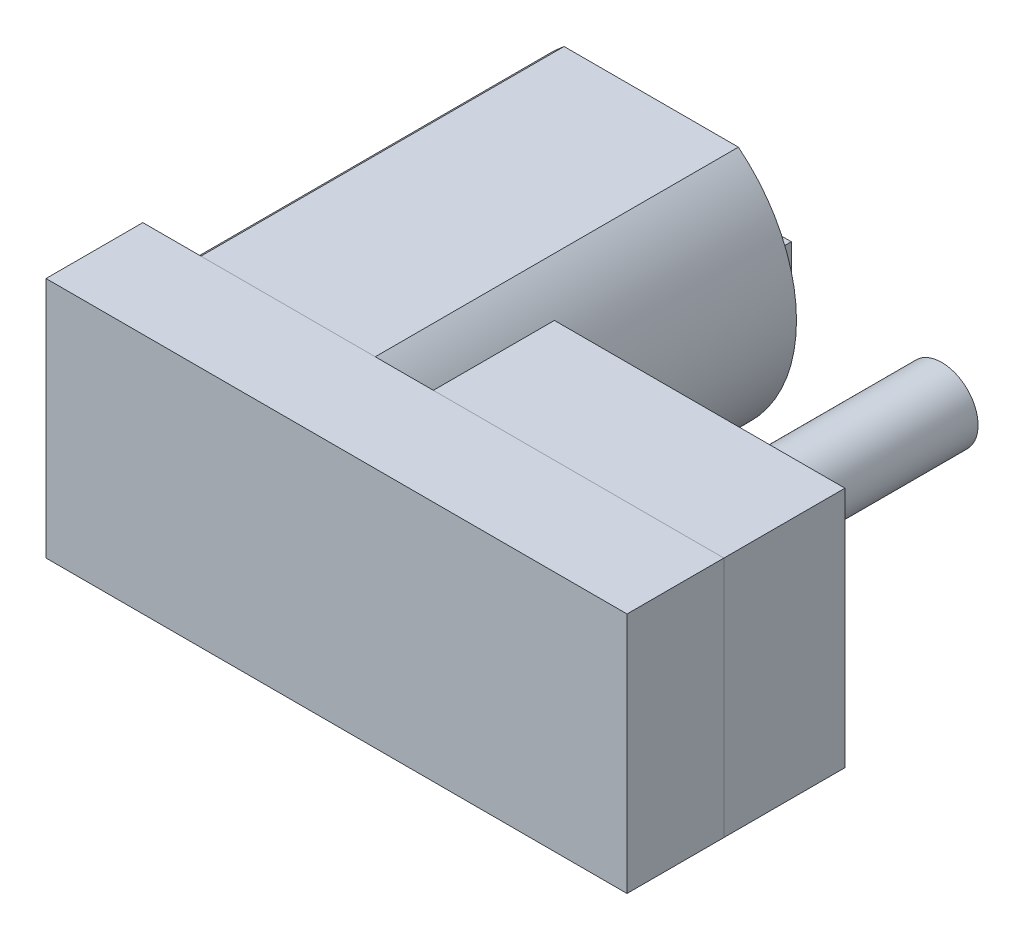
ISO-10303-21;
HEADER;
FILE_DESCRIPTION(('STEP AP214'),'2;1');
FILE_NAME('part.step','',(''),(''),'','','');
FILE_SCHEMA(('AUTOMOTIVE_DESIGN { 1 0 10303 214 1 1 1 1 }'));
ENDSEC;
DATA;
#1=APPLICATION_CONTEXT('core data for automotive mechanical design processes');
#2=APPLICATION_PROTOCOL_DEFINITION('international standard','automotive_design',2000,#1);
#3=PRODUCT_CONTEXT('',#1,'mechanical');
#4=PRODUCT('Part','Part','',(#3));
#5=PRODUCT_RELATED_PRODUCT_CATEGORY('part','',(#4));
#6=PRODUCT_DEFINITION_FORMATION('','',#4);
#7=PRODUCT_DEFINITION_CONTEXT('part definition',#1,'design');
#8=PRODUCT_DEFINITION('design','',#6,#7);
#9=PRODUCT_DEFINITION_SHAPE('','',#8);
#10=(LENGTH_UNIT() NAMED_UNIT(*) SI_UNIT(.MILLI.,.METRE.));
#11=(NAMED_UNIT(*) PLANE_ANGLE_UNIT() SI_UNIT($,.RADIAN.));
#12=(NAMED_UNIT(*) SI_UNIT($,.STERADIAN.) SOLID_ANGLE_UNIT());
#13=UNCERTAINTY_MEASURE_WITH_UNIT(LENGTH_MEASURE(1.E-05),#10,'distance_accuracy_value','');
#14=(GEOMETRIC_REPRESENTATION_CONTEXT(3) GLOBAL_UNCERTAINTY_ASSIGNED_CONTEXT((#13)) GLOBAL_UNIT_ASSIGNED_CONTEXT((#10,
#11,#12)) REPRESENTATION_CONTEXT('',''));
#15=CARTESIAN_POINT('',(0.,0.,0.));
#16=DIRECTION('',(0.,0.,1.));
#17=DIRECTION('',(1.,0.,0.));
#18=AXIS2_PLACEMENT_3D('',#15,#16,#17);
#19=CARTESIAN_POINT('',(18.,5.,-19.));
#20=DIRECTION('',(0.,0.,1.));
#21=DIRECTION('',(1.,0.,0.));
#22=AXIS2_PLACEMENT_3D('',#19,#20,#21);
#23=CYLINDRICAL_SURFACE('',#22,1.5);
#24=CARTESIAN_POINT('',(18.,5.,-19.));
#25=DIRECTION('',(0.,0.,-1.));
#26=DIRECTION('',(-1.,0.,0.));
#27=AXIS2_PLACEMENT_3D('',#24,#25,#26);
#28=CIRCLE('',#27,1.5);
#29=CARTESIAN_POINT('',(16.5,5.,-19.));
#30=VERTEX_POINT('',#29);
#31=EDGE_CURVE('E11',#30,#30,#28,.T.);
#32=ORIENTED_EDGE('',*,*,#31,.F.);
#33=EDGE_LOOP('',(#32));
#34=FACE_BOUND('',#33,.T.);
#35=CARTESIAN_POINT('',(18.,5.,-9.));
#36=DIRECTION('',(0.,0.,-1.));
#37=DIRECTION('',(-1.,0.,0.));
#38=AXIS2_PLACEMENT_3D('',#35,#36,#37);
#39=CIRCLE('',#38,1.5);
#40=CARTESIAN_POINT('',(16.5,5.,-9.));
#41=VERTEX_POINT('',#40);
#42=EDGE_CURVE('E54',#41,#41,#39,.T.);
#43=ORIENTED_EDGE('',*,*,#42,.T.);
#44=EDGE_LOOP('',(#43));
#45=FACE_BOUND('',#44,.T.);
#46=ADVANCED_FACE('F51',(#34,#45),#23,.T.);
#47=CARTESIAN_POINT('',(0.,0.,-19.));
#48=DIRECTION('',(0.,0.,-1.));
#49=DIRECTION('',(-1.,0.,0.));
#50=AXIS2_PLACEMENT_3D('',#47,#48,#49);
#51=PLANE('',#50);
#52=ORIENTED_EDGE('',*,*,#31,.T.);
#53=EDGE_LOOP('',(#52));
#54=FACE_BOUND('',#53,.T.);
#55=ADVANCED_FACE('F66',(#54),#51,.T.);
#56=CARTESIAN_POINT('',(0.,0.,-9.));
#57=DIRECTION('',(0.,0.,-1.));
#58=DIRECTION('',(-1.,0.,0.));
#59=AXIS2_PLACEMENT_3D('',#56,#57,#58);
#60=PLANE('',#59);
#61=ORIENTED_EDGE('',*,*,#42,.F.);
#62=EDGE_LOOP('',(#61));
#63=FACE_BOUND('',#62,.T.);
#64=ADVANCED_FACE('F64',(#63),#60,.F.);
#65=CLOSED_SHELL('',(#46,#55,#64));
#66=MANIFOLD_SOLID_BREP('B2',#65);
#67=CARTESIAN_POINT('',(24.,10.,-9.));
#68=DIRECTION('',(-1.,0.,0.));
#69=DIRECTION('',(0.,0.,1.));
#70=AXIS2_PLACEMENT_3D('',#67,#68,#69);
#71=PLANE('',#70);
#72=DIRECTION('',(0.,-1.,0.));
#73=VECTOR('',#72,1.);
#74=CARTESIAN_POINT('',(24.,10.,-4.));
#75=LINE('',#74,#73);
#76=CARTESIAN_POINT('',(24.,10.,-4.));
#77=VERTEX_POINT('',#76);
#78=CARTESIAN_POINT('',(24.,0.,-4.));
#79=VERTEX_POINT('',#78);
#80=EDGE_CURVE('E164',#77,#79,#75,.T.);
#81=ORIENTED_EDGE('',*,*,#80,.T.);
#82=DIRECTION('',(0.,0.,1.));
#83=VECTOR('',#82,1.);
#84=CARTESIAN_POINT('',(24.,0.,-9.));
#85=LINE('',#84,#83);
#86=CARTESIAN_POINT('',(24.,0.,-9.));
#87=VERTEX_POINT('',#86);
#88=EDGE_CURVE('E49',#87,#79,#85,.T.);
#89=ORIENTED_EDGE('',*,*,#88,.F.);
#90=DIRECTION('',(0.,-1.,0.));
#91=VECTOR('',#90,1.);
#92=CARTESIAN_POINT('',(24.,10.,-9.));
#93=LINE('',#92,#91);
#94=CARTESIAN_POINT('',(24.,10.,-9.));
#95=VERTEX_POINT('',#94);
#96=EDGE_CURVE('E152',#95,#87,#93,.T.);
#97=ORIENTED_EDGE('',*,*,#96,.F.);
#98=DIRECTION('',(0.,0.,1.));
#99=VECTOR('',#98,1.);
#100=CARTESIAN_POINT('',(24.,10.,-9.));
#101=LINE('',#100,#99);
#102=EDGE_CURVE('E160',#95,#77,#101,.T.);
#103=ORIENTED_EDGE('',*,*,#102,.T.);
#104=EDGE_LOOP('',(#81,#89,#97,#103));
#105=FACE_BOUND('',#104,.T.);
#106=ADVANCED_FACE('F101',(#105),#71,.F.);
#107=CARTESIAN_POINT('',(24.,0.,-9.));
#108=DIRECTION('',(0.,1.,0.));
#109=DIRECTION('',(0.,0.,1.));
#110=AXIS2_PLACEMENT_3D('',#107,#108,#109);
#111=PLANE('',#110);
#112=DIRECTION('',(-1.,0.,0.));
#113=VECTOR('',#112,1.);
#114=CARTESIAN_POINT('',(24.,0.,-4.));
#115=LINE('',#114,#113);
#116=CARTESIAN_POINT('',(12.,0.,-4.));
#117=VERTEX_POINT('',#116);
#118=EDGE_CURVE('E156',#79,#117,#115,.T.);
#119=ORIENTED_EDGE('',*,*,#118,.T.);
#120=DIRECTION('',(0.,0.,1.));
#121=VECTOR('',#120,1.);
#122=CARTESIAN_POINT('',(12.,0.,-9.));
#123=LINE('',#122,#121);
#124=CARTESIAN_POINT('',(12.,0.,-9.));
#125=VERTEX_POINT('',#124);
#126=EDGE_CURVE('E109',#125,#117,#123,.T.);
#127=ORIENTED_EDGE('',*,*,#126,.F.);
#128=DIRECTION('',(-1.,0.,0.));
#129=VECTOR('',#128,1.);
#130=CARTESIAN_POINT('',(24.,0.,-9.));
#131=LINE('',#130,#129);
#132=EDGE_CURVE('E147',#87,#125,#131,.T.);
#133=ORIENTED_EDGE('',*,*,#132,.F.);
#134=ORIENTED_EDGE('',*,*,#88,.T.);
#135=EDGE_LOOP('',(#119,#127,#133,#134));
#136=FACE_BOUND('',#135,.T.);
#137=ADVANCED_FACE('F155',(#136),#111,.F.);
#138=CARTESIAN_POINT('',(12.,10.,-9.));
#139=DIRECTION('',(1.,0.,0.));
#140=DIRECTION('',(0.,0.,-1.));
#141=AXIS2_PLACEMENT_3D('',#138,#139,#140);
#142=PLANE('',#141);
#143=DIRECTION('',(0.,1.,0.));
#144=VECTOR('',#143,1.);
#145=CARTESIAN_POINT('',(12.,10.,-4.));
#146=LINE('',#145,#144);
#147=CARTESIAN_POINT('',(12.,10.,-4.));
#148=VERTEX_POINT('',#147);
#149=EDGE_CURVE('E134',#117,#148,#146,.T.);
#150=ORIENTED_EDGE('',*,*,#149,.T.);
#151=DIRECTION('',(0.,0.,1.));
#152=VECTOR('',#151,1.);
#153=CARTESIAN_POINT('',(12.,10.,-9.));
#154=LINE('',#153,#152);
#155=CARTESIAN_POINT('',(12.,10.,-9.));
#156=VERTEX_POINT('',#155);
#157=EDGE_CURVE('E157',#156,#148,#154,.T.);
#158=ORIENTED_EDGE('',*,*,#157,.F.);
#159=DIRECTION('',(0.,1.,0.));
#160=VECTOR('',#159,1.);
#161=CARTESIAN_POINT('',(12.,10.,-9.));
#162=LINE('',#161,#160);
#163=EDGE_CURVE('E150',#125,#156,#162,.T.);
#164=ORIENTED_EDGE('',*,*,#163,.F.);
#165=ORIENTED_EDGE('',*,*,#126,.T.);
#166=EDGE_LOOP('',(#150,#158,#164,#165));
#167=FACE_BOUND('',#166,.T.);
#168=ADVANCED_FACE('F158',(#167),#142,.F.);
#169=CARTESIAN_POINT('',(24.,10.,-9.));
#170=DIRECTION('',(0.,-1.,0.));
#171=DIRECTION('',(0.,0.,-1.));
#172=AXIS2_PLACEMENT_3D('',#169,#170,#171);
#173=PLANE('',#172);
#174=DIRECTION('',(1.,0.,0.));
#175=VECTOR('',#174,1.);
#176=CARTESIAN_POINT('',(24.,10.,-4.));
#177=LINE('',#176,#175);
#178=EDGE_CURVE('E140',#148,#77,#177,.T.);
#179=ORIENTED_EDGE('',*,*,#178,.T.);
#180=ORIENTED_EDGE('',*,*,#102,.F.);
#181=DIRECTION('',(1.,0.,0.));
#182=VECTOR('',#181,1.);
#183=CARTESIAN_POINT('',(24.,10.,-9.));
#184=LINE('',#183,#182);
#185=EDGE_CURVE('E117',#156,#95,#184,.T.);
#186=ORIENTED_EDGE('',*,*,#185,.F.);
#187=ORIENTED_EDGE('',*,*,#157,.T.);
#188=EDGE_LOOP('',(#179,#180,#186,#187));
#189=FACE_BOUND('',#188,.T.);
#190=ADVANCED_FACE('F172',(#189),#173,.F.);
#191=CARTESIAN_POINT('',(0.,0.,-9.));
#192=DIRECTION('',(0.,0.,-1.));
#193=DIRECTION('',(-1.,0.,0.));
#194=AXIS2_PLACEMENT_3D('',#191,#192,#193);
#195=PLANE('',#194);
#196=CARTESIAN_POINT('',(22.5,5.,-9.));
#197=DIRECTION('',(0.,0.,-1.));
#198=DIRECTION('',(-1.,0.,0.));
#199=AXIS2_PLACEMENT_3D('',#196,#197,#198);
#200=CIRCLE('',#199,0.625000000000001);
#201=CARTESIAN_POINT('',(21.875,5.,-9.));
#202=VERTEX_POINT('',#201);
#203=EDGE_CURVE('E186',#202,#202,#200,.T.);
#204=ORIENTED_EDGE('',*,*,#203,.F.);
#205=EDGE_LOOP('',(#204));
#206=FACE_BOUND('',#205,.T.);
#207=CARTESIAN_POINT('',(13.5,5.,-9.));
#208=DIRECTION('',(0.,0.,-1.));
#209=DIRECTION('',(-1.,0.,0.));
#210=AXIS2_PLACEMENT_3D('',#207,#208,#209);
#211=CIRCLE('',#210,0.625000000000001);
#212=CARTESIAN_POINT('',(12.875,5.,-9.));
#213=VERTEX_POINT('',#212);
#214=EDGE_CURVE('E180',#213,#213,#211,.T.);
#215=ORIENTED_EDGE('',*,*,#214,.F.);
#216=EDGE_LOOP('',(#215));
#217=FACE_BOUND('',#216,.T.);
#218=ORIENTED_EDGE('',*,*,#96,.T.);
#219=ORIENTED_EDGE('',*,*,#132,.T.);
#220=ORIENTED_EDGE('',*,*,#163,.T.);
#221=ORIENTED_EDGE('',*,*,#185,.T.);
#222=EDGE_LOOP('',(#218,#219,#220,#221));
#223=FACE_BOUND('',#222,.T.);
#224=ADVANCED_FACE('F148',(#206,#217,#223),#195,.T.);
#225=CARTESIAN_POINT('',(0.,0.,-4.));
#226=DIRECTION('',(0.,0.,-1.));
#227=DIRECTION('',(-1.,0.,0.));
#228=AXIS2_PLACEMENT_3D('',#225,#226,#227);
#229=PLANE('',#228);
#230=CARTESIAN_POINT('',(22.5,5.,-4.));
#231=DIRECTION('',(0.,0.,-1.));
#232=DIRECTION('',(-1.,0.,0.));
#233=AXIS2_PLACEMENT_3D('',#230,#231,#232);
#234=CIRCLE('',#233,0.624999999999999);
#235=CARTESIAN_POINT('',(21.875,5.,-4.));
#236=VERTEX_POINT('',#235);
#237=EDGE_CURVE('E183',#236,#236,#234,.T.);
#238=ORIENTED_EDGE('',*,*,#237,.T.);
#239=EDGE_LOOP('',(#238));
#240=FACE_BOUND('',#239,.T.);
#241=CARTESIAN_POINT('',(13.5,5.,-4.));
#242=DIRECTION('',(0.,0.,-1.));
#243=DIRECTION('',(-1.,0.,0.));
#244=AXIS2_PLACEMENT_3D('',#241,#242,#243);
#245=CIRCLE('',#244,0.625);
#246=CARTESIAN_POINT('',(12.875,5.,-4.));
#247=VERTEX_POINT('',#246);
#248=EDGE_CURVE('E167',#247,#247,#245,.T.);
#249=ORIENTED_EDGE('',*,*,#248,.T.);
#250=EDGE_LOOP('',(#249));
#251=FACE_BOUND('',#250,.T.);
#252=ORIENTED_EDGE('',*,*,#80,.F.);
#253=ORIENTED_EDGE('',*,*,#178,.F.);
#254=ORIENTED_EDGE('',*,*,#149,.F.);
#255=ORIENTED_EDGE('',*,*,#118,.F.);
#256=EDGE_LOOP('',(#252,#253,#254,#255));
#257=FACE_BOUND('',#256,.T.);
#258=ADVANCED_FACE('F175',(#240,#251,#257),#229,.F.);
#259=CARTESIAN_POINT('',(13.5,5.,-9.));
#260=DIRECTION('',(0.,0.,-1.));
#261=DIRECTION('',(-1.,0.,0.));
#262=AXIS2_PLACEMENT_3D('',#259,#260,#261);
#263=CYLINDRICAL_SURFACE('',#262,0.625);
#264=ORIENTED_EDGE('',*,*,#248,.F.);
#265=EDGE_LOOP('',(#264));
#266=FACE_BOUND('',#265,.T.);
#267=ORIENTED_EDGE('',*,*,#214,.T.);
#268=EDGE_LOOP('',(#267));
#269=FACE_BOUND('',#268,.T.);
#270=ADVANCED_FACE('F197',(#266,#269),#263,.F.);
#271=CARTESIAN_POINT('',(22.5,5.,-9.));
#272=DIRECTION('',(0.,0.,-1.));
#273=DIRECTION('',(-1.,0.,0.));
#274=AXIS2_PLACEMENT_3D('',#271,#272,#273);
#275=CYLINDRICAL_SURFACE('',#274,0.624999999999999);
#276=ORIENTED_EDGE('',*,*,#237,.F.);
#277=EDGE_LOOP('',(#276));
#278=FACE_BOUND('',#277,.T.);
#279=ORIENTED_EDGE('',*,*,#203,.T.);
#280=EDGE_LOOP('',(#279));
#281=FACE_BOUND('',#280,.T.);
#282=ADVANCED_FACE('F190',(#278,#281),#275,.F.);
#283=CLOSED_SHELL('',(#106,#137,#168,#190,#224,#258,#270,#282));
#284=MANIFOLD_SOLID_BREP('B6',#283);
#285=CARTESIAN_POINT('',(5.59166666666667,5.,-19.));
#286=DIRECTION('',(0.,0.,-1.));
#287=DIRECTION('',(-1.,0.,0.));
#288=AXIS2_PLACEMENT_3D('',#285,#286,#287);
#289=PLANE('',#288);
#290=CARTESIAN_POINT('',(6.0560567624961,4.51584889222545,-19.));
#291=DIRECTION('',(0.,0.,-1.));
#292=DIRECTION('',(-1.,0.,0.));
#293=AXIS2_PLACEMENT_3D('',#290,#291,#292);
#294=CIRCLE('',#293,1.22370081126123);
#295=CARTESIAN_POINT('',(4.83235595123487,4.51584889222545,-19.));
#296=VERTEX_POINT('',#295);
#297=EDGE_CURVE('E666',#296,#296,#294,.T.);
#298=ORIENTED_EDGE('',*,*,#297,.F.);
#299=EDGE_LOOP('',(#298));
#300=FACE_BOUND('',#299,.T.);
#301=CARTESIAN_POINT('',(5.59166666666667,5.,-19.));
#302=DIRECTION('',(0.,0.,-1.));
#303=DIRECTION('',(-1.,0.,0.));
#304=AXIS2_PLACEMENT_3D('',#301,#302,#303);
#305=CIRCLE('',#304,6.40833333333333);
#306=CARTESIAN_POINT('',(9.6,10.,-19.));
#307=VERTEX_POINT('',#306);
#308=CARTESIAN_POINT('',(9.6,0.,-19.));
#309=VERTEX_POINT('',#308);
#310=EDGE_CURVE('E464',#307,#309,#305,.T.);
#311=ORIENTED_EDGE('',*,*,#310,.T.);
#312=DIRECTION('',(-1.,0.,0.));
#313=VECTOR('',#312,1.);
#314=CARTESIAN_POINT('',(9.6,0.,-19.));
#315=LINE('',#314,#313);
#316=CARTESIAN_POINT('',(2.4,0.,-19.));
#317=VERTEX_POINT('',#316);
#318=EDGE_CURVE('E468',#309,#317,#315,.T.);
#319=ORIENTED_EDGE('',*,*,#318,.T.);
#320=CARTESIAN_POINT('',(6.40833333333333,5.,-19.));
#321=DIRECTION('',(0.,0.,-1.));
#322=DIRECTION('',(1.,0.,0.));
#323=AXIS2_PLACEMENT_3D('',#320,#321,#322);
#324=CIRCLE('',#323,6.40833333333333);
#325=CARTESIAN_POINT('',(2.4,10.,-19.));
#326=VERTEX_POINT('',#325);
#327=EDGE_CURVE('E472',#317,#326,#324,.T.);
#328=ORIENTED_EDGE('',*,*,#327,.T.);
#329=DIRECTION('',(1.,0.,0.));
#330=VECTOR('',#329,1.);
#331=CARTESIAN_POINT('',(9.6,10.,-19.));
#332=LINE('',#331,#330);
#333=EDGE_CURVE('E475',#326,#307,#332,.T.);
#334=ORIENTED_EDGE('',*,*,#333,.T.);
#335=EDGE_LOOP('',(#311,#319,#328,#334));
#336=FACE_BOUND('',#335,.T.);
#337=DIRECTION('',(1.,0.,0.));
#338=VECTOR('',#337,1.);
#339=CARTESIAN_POINT('',(9.48656645165732,3.06119820900896,-19.));
#340=LINE('',#339,#338);
#341=CARTESIAN_POINT('',(9.48656645165732,3.06119820900896,-19.));
#342=VERTEX_POINT('',#341);
#343=CARTESIAN_POINT('',(9.98656645165732,3.06119820900896,-19.));
#344=VERTEX_POINT('',#343);
#345=EDGE_CURVE('E440',#342,#344,#340,.T.);
#346=ORIENTED_EDGE('',*,*,#345,.T.);
#347=DIRECTION('',(0.,1.,0.));
#348=VECTOR('',#347,1.);
#349=CARTESIAN_POINT('',(9.98656645165732,5.9092593719523,-19.));
#350=LINE('',#349,#348);
#351=CARTESIAN_POINT('',(9.98656645165732,5.9092593719523,-19.));
#352=VERTEX_POINT('',#351);
#353=EDGE_CURVE('E389',#352,#344,#350,.F.);
#354=ORIENTED_EDGE('',*,*,#353,.F.);
#355=DIRECTION('',(-1.,0.,0.));
#356=VECTOR('',#355,1.);
#357=CARTESIAN_POINT('',(9.98656645165732,5.9092593719523,-19.));
#358=LINE('',#357,#356);
#359=CARTESIAN_POINT('',(9.48656645165732,5.9092593719523,-19.));
#360=VERTEX_POINT('',#359);
#361=EDGE_CURVE('E424',#352,#360,#358,.T.);
#362=ORIENTED_EDGE('',*,*,#361,.T.);
#363=DIRECTION('',(0.,1.,0.));
#364=VECTOR('',#363,1.);
#365=CARTESIAN_POINT('',(9.48656645165732,5.9092593719523,-19.));
#366=LINE('',#365,#364);
#367=EDGE_CURVE('E443',#360,#342,#366,.F.);
#368=ORIENTED_EDGE('',*,*,#367,.T.);
#369=EDGE_LOOP('',(#346,#354,#362,#368));
#370=FACE_BOUND('',#369,.T.);
#371=DIRECTION('',(-1.,0.,0.));
#372=VECTOR('',#371,1.);
#373=CARTESIAN_POINT('',(2.56089830410269,5.9092593719523,-19.));
#374=LINE('',#373,#372);
#375=CARTESIAN_POINT('',(2.56089830410269,5.9092593719523,-19.));
#376=VERTEX_POINT('',#375);
#377=CARTESIAN_POINT('',(2.06089830410269,5.9092593719523,-19.));
#378=VERTEX_POINT('',#377);
#379=EDGE_CURVE('E295',#376,#378,#374,.T.);
#380=ORIENTED_EDGE('',*,*,#379,.T.);
#381=DIRECTION('',(0.,1.,0.));
#382=VECTOR('',#381,1.);
#383=CARTESIAN_POINT('',(2.06089830410269,3.06119820900896,-19.));
#384=LINE('',#383,#382);
#385=CARTESIAN_POINT('',(2.06089830410269,3.06119820900896,-19.));
#386=VERTEX_POINT('',#385);
#387=EDGE_CURVE('E386',#386,#378,#384,.T.);
#388=ORIENTED_EDGE('',*,*,#387,.F.);
#389=DIRECTION('',(1.,0.,0.));
#390=VECTOR('',#389,1.);
#391=CARTESIAN_POINT('',(2.06089830410269,3.06119820900896,-19.));
#392=LINE('',#391,#390);
#393=CARTESIAN_POINT('',(2.56089830410269,3.06119820900896,-19.));
#394=VERTEX_POINT('',#393);
#395=EDGE_CURVE('E381',#386,#394,#392,.T.);
#396=ORIENTED_EDGE('',*,*,#395,.T.);
#397=DIRECTION('',(0.,1.,0.));
#398=VECTOR('',#397,1.);
#399=CARTESIAN_POINT('',(2.56089830410269,3.06119820900896,-19.));
#400=LINE('',#399,#398);
#401=EDGE_CURVE('E300',#394,#376,#400,.T.);
#402=ORIENTED_EDGE('',*,*,#401,.T.);
#403=EDGE_LOOP('',(#380,#388,#396,#402));
#404=FACE_BOUND('',#403,.T.);
#405=ADVANCED_FACE('F279',(#300,#336,#370,#404),#289,.T.);
#406=CARTESIAN_POINT('',(5.59166666666667,5.,-19.));
#407=DIRECTION('',(0.,0.,1.));
#408=DIRECTION('',(1.,0.,0.));
#409=AXIS2_PLACEMENT_3D('',#406,#407,#408);
#410=CYLINDRICAL_SURFACE('',#409,6.40833333333333);
#411=CARTESIAN_POINT('',(5.59166666666667,5.,-4.));
#412=DIRECTION('',(0.,0.,-1.));
#413=DIRECTION('',(-1.,0.,0.));
#414=AXIS2_PLACEMENT_3D('',#411,#412,#413);
#415=CIRCLE('',#414,6.40833333333333);
#416=CARTESIAN_POINT('',(9.6,10.,-4.));
#417=VERTEX_POINT('',#416);
#418=CARTESIAN_POINT('',(9.6,0.,-4.));
#419=VERTEX_POINT('',#418);
#420=EDGE_CURVE('E463',#417,#419,#415,.T.);
#421=ORIENTED_EDGE('',*,*,#420,.T.);
#422=DIRECTION('',(0.,0.,1.));
#423=VECTOR('',#422,1.);
#424=CARTESIAN_POINT('',(9.6,0.,-19.));
#425=LINE('',#424,#423);
#426=EDGE_CURVE('E99',#309,#419,#425,.T.);
#427=ORIENTED_EDGE('',*,*,#426,.F.);
#428=ORIENTED_EDGE('',*,*,#310,.F.);
#429=DIRECTION('',(0.,0.,1.));
#430=VECTOR('',#429,1.);
#431=CARTESIAN_POINT('',(9.6,10.,-19.));
#432=LINE('',#431,#430);
#433=EDGE_CURVE('E478',#307,#417,#432,.T.);
#434=ORIENTED_EDGE('',*,*,#433,.T.);
#435=EDGE_LOOP('',(#421,#427,#428,#434));
#436=FACE_BOUND('',#435,.T.);
#437=ADVANCED_FACE('F281',(#436),#410,.T.);
#438=CARTESIAN_POINT('',(9.6,0.,-19.));
#439=DIRECTION('',(0.,1.,0.));
#440=DIRECTION('',(-1.,0.,0.));
#441=AXIS2_PLACEMENT_3D('',#438,#439,#440);
#442=PLANE('',#441);
#443=DIRECTION('',(-1.,0.,0.));
#444=VECTOR('',#443,1.);
#445=CARTESIAN_POINT('',(9.6,0.,-4.));
#446=LINE('',#445,#444);
#447=CARTESIAN_POINT('',(2.4,0.,-4.));
#448=VERTEX_POINT('',#447);
#449=EDGE_CURVE('E482',#419,#448,#446,.T.);
#450=ORIENTED_EDGE('',*,*,#449,.T.);
#451=DIRECTION('',(0.,0.,1.));
#452=VECTOR('',#451,1.);
#453=CARTESIAN_POINT('',(2.4,0.,-19.));
#454=LINE('',#453,#452);
#455=EDGE_CURVE('E288',#317,#448,#454,.T.);
#456=ORIENTED_EDGE('',*,*,#455,.F.);
#457=ORIENTED_EDGE('',*,*,#318,.F.);
#458=ORIENTED_EDGE('',*,*,#426,.T.);
#459=EDGE_LOOP('',(#450,#456,#457,#458));
#460=FACE_BOUND('',#459,.T.);
#461=ADVANCED_FACE('F518',(#460),#442,.F.);
#462=CARTESIAN_POINT('',(6.40833333333333,5.,-19.));
#463=DIRECTION('',(0.,0.,1.));
#464=DIRECTION('',(1.,0.,0.));
#465=AXIS2_PLACEMENT_3D('',#462,#463,#464);
#466=CYLINDRICAL_SURFACE('',#465,6.40833333333333);
#467=CARTESIAN_POINT('',(6.40833333333333,5.,-4.));
#468=DIRECTION('',(0.,0.,-1.));
#469=DIRECTION('',(1.,0.,0.));
#470=AXIS2_PLACEMENT_3D('',#467,#468,#469);
#471=CIRCLE('',#470,6.40833333333333);
#472=CARTESIAN_POINT('',(2.4,10.,-4.));
#473=VERTEX_POINT('',#472);
#474=EDGE_CURVE('E485',#448,#473,#471,.T.);
#475=ORIENTED_EDGE('',*,*,#474,.T.);
#476=DIRECTION('',(0.,0.,1.));
#477=VECTOR('',#476,1.);
#478=CARTESIAN_POINT('',(2.4,10.,-19.));
#479=LINE('',#478,#477);
#480=EDGE_CURVE('E493',#326,#473,#479,.T.);
#481=ORIENTED_EDGE('',*,*,#480,.F.);
#482=ORIENTED_EDGE('',*,*,#327,.F.);
#483=ORIENTED_EDGE('',*,*,#455,.T.);
#484=EDGE_LOOP('',(#475,#481,#482,#483));
#485=FACE_BOUND('',#484,.T.);
#486=ADVANCED_FACE('F502',(#485),#466,.T.);
#487=CARTESIAN_POINT('',(9.6,10.,-19.));
#488=DIRECTION('',(0.,-1.,0.));
#489=DIRECTION('',(0.,0.,-1.));
#490=AXIS2_PLACEMENT_3D('',#487,#488,#489);
#491=PLANE('',#490);
#492=DIRECTION('',(1.,0.,0.));
#493=VECTOR('',#492,1.);
#494=CARTESIAN_POINT('',(9.6,10.,-4.));
#495=LINE('',#494,#493);
#496=EDGE_CURVE('E469',#473,#417,#495,.T.);
#497=ORIENTED_EDGE('',*,*,#496,.T.);
#498=ORIENTED_EDGE('',*,*,#433,.F.);
#499=ORIENTED_EDGE('',*,*,#333,.F.);
#500=ORIENTED_EDGE('',*,*,#480,.T.);
#501=EDGE_LOOP('',(#497,#498,#499,#500));
#502=FACE_BOUND('',#501,.T.);
#503=ADVANCED_FACE('F511',(#502),#491,.F.);
#504=CARTESIAN_POINT('',(5.59166666666667,5.,-4.));
#505=DIRECTION('',(0.,0.,-1.));
#506=DIRECTION('',(-1.,0.,0.));
#507=AXIS2_PLACEMENT_3D('',#504,#505,#506);
#508=PLANE('',#507);
#509=ORIENTED_EDGE('',*,*,#420,.F.);
#510=ORIENTED_EDGE('',*,*,#496,.F.);
#511=ORIENTED_EDGE('',*,*,#474,.F.);
#512=ORIENTED_EDGE('',*,*,#449,.F.);
#513=EDGE_LOOP('',(#509,#510,#511,#512));
#514=FACE_BOUND('',#513,.T.);
#515=ADVANCED_FACE('F508',(#514),#508,.F.);
#516=CARTESIAN_POINT('',(9.98656645165732,5.9092593719523,-20.8));
#517=DIRECTION('',(-1.,0.,0.));
#518=DIRECTION('',(0.,0.,1.));
#519=AXIS2_PLACEMENT_3D('',#516,#517,#518);
#520=PLANE('',#519);
#521=ORIENTED_EDGE('',*,*,#353,.T.);
#522=DIRECTION('',(0.,0.,1.));
#523=VECTOR('',#522,1.);
#524=CARTESIAN_POINT('',(9.98656645165732,3.06119820900896,-20.8));
#525=LINE('',#524,#523);
#526=CARTESIAN_POINT('',(9.98656645165732,3.06119820900896,-20.8));
#527=VERTEX_POINT('',#526);
#528=EDGE_CURVE('E459',#527,#344,#525,.T.);
#529=ORIENTED_EDGE('',*,*,#528,.F.);
#530=DIRECTION('',(0.,1.,0.));
#531=VECTOR('',#530,1.);
#532=CARTESIAN_POINT('',(9.98656645165732,5.9092593719523,-20.8));
#533=LINE('',#532,#531);
#534=CARTESIAN_POINT('',(9.98656645165732,5.9092593719523,-20.8));
#535=VERTEX_POINT('',#534);
#536=EDGE_CURVE('E420',#535,#527,#533,.F.);
#537=ORIENTED_EDGE('',*,*,#536,.F.);
#538=DIRECTION('',(0.,0.,1.));
#539=VECTOR('',#538,1.);
#540=CARTESIAN_POINT('',(9.98656645165732,5.9092593719523,-20.8));
#541=LINE('',#540,#539);
#542=EDGE_CURVE('E436',#535,#352,#541,.T.);
#543=ORIENTED_EDGE('',*,*,#542,.T.);
#544=EDGE_LOOP('',(#521,#529,#537,#543));
#545=FACE_BOUND('',#544,.T.);
#546=ADVANCED_FACE('F535',(#545),#520,.F.);
#547=CARTESIAN_POINT('',(9.48656645165732,3.06119820900896,-20.8));
#548=DIRECTION('',(0.,-1.,0.));
#549=DIRECTION('',(0.,0.,-1.));
#550=AXIS2_PLACEMENT_3D('',#547,#548,#549);
#551=PLANE('',#550);
#552=ORIENTED_EDGE('',*,*,#345,.F.);
#553=DIRECTION('',(0.,0.,1.));
#554=VECTOR('',#553,1.);
#555=CARTESIAN_POINT('',(9.48656645165732,3.06119820900896,-20.8));
#556=LINE('',#555,#554);
#557=CARTESIAN_POINT('',(9.48656645165732,3.06119820900896,-20.8));
#558=VERTEX_POINT('',#557);
#559=EDGE_CURVE('E455',#558,#342,#556,.T.);
#560=ORIENTED_EDGE('',*,*,#559,.F.);
#561=DIRECTION('',(1.,0.,0.));
#562=VECTOR('',#561,1.);
#563=CARTESIAN_POINT('',(9.48656645165732,3.06119820900896,-20.8));
#564=LINE('',#563,#562);
#565=EDGE_CURVE('E423',#558,#527,#564,.T.);
#566=ORIENTED_EDGE('',*,*,#565,.T.);
#567=ORIENTED_EDGE('',*,*,#528,.T.);
#568=EDGE_LOOP('',(#552,#560,#566,#567));
#569=FACE_BOUND('',#568,.T.);
#570=ADVANCED_FACE('F559',(#569),#551,.T.);
#571=CARTESIAN_POINT('',(9.48656645165732,5.9092593719523,-20.8));
#572=DIRECTION('',(-1.,0.,0.));
#573=DIRECTION('',(0.,0.,1.));
#574=AXIS2_PLACEMENT_3D('',#571,#572,#573);
#575=PLANE('',#574);
#576=ORIENTED_EDGE('',*,*,#367,.F.);
#577=DIRECTION('',(0.,0.,1.));
#578=VECTOR('',#577,1.);
#579=CARTESIAN_POINT('',(9.48656645165732,5.9092593719523,-20.8));
#580=LINE('',#579,#578);
#581=CARTESIAN_POINT('',(9.48656645165732,5.9092593719523,-20.8));
#582=VERTEX_POINT('',#581);
#583=EDGE_CURVE('E451',#582,#360,#580,.T.);
#584=ORIENTED_EDGE('',*,*,#583,.F.);
#585=DIRECTION('',(0.,1.,0.));
#586=VECTOR('',#585,1.);
#587=CARTESIAN_POINT('',(9.48656645165732,5.9092593719523,-20.8));
#588=LINE('',#587,#586);
#589=EDGE_CURVE('E428',#582,#558,#588,.F.);
#590=ORIENTED_EDGE('',*,*,#589,.T.);
#591=ORIENTED_EDGE('',*,*,#559,.T.);
#592=EDGE_LOOP('',(#576,#584,#590,#591));
#593=FACE_BOUND('',#592,.T.);
#594=ADVANCED_FACE('F565',(#593),#575,.T.);
#595=CARTESIAN_POINT('',(9.98656645165732,5.9092593719523,-20.8));
#596=DIRECTION('',(0.,1.,0.));
#597=DIRECTION('',(0.,0.,1.));
#598=AXIS2_PLACEMENT_3D('',#595,#596,#597);
#599=PLANE('',#598);
#600=ORIENTED_EDGE('',*,*,#361,.F.);
#601=ORIENTED_EDGE('',*,*,#542,.F.);
#602=DIRECTION('',(-1.,0.,0.));
#603=VECTOR('',#602,1.);
#604=CARTESIAN_POINT('',(9.98656645165732,5.9092593719523,-20.8));
#605=LINE('',#604,#603);
#606=EDGE_CURVE('E432',#535,#582,#605,.T.);
#607=ORIENTED_EDGE('',*,*,#606,.T.);
#608=ORIENTED_EDGE('',*,*,#583,.T.);
#609=EDGE_LOOP('',(#600,#601,#607,#608));
#610=FACE_BOUND('',#609,.T.);
#611=ADVANCED_FACE('F572',(#610),#599,.T.);
#612=CARTESIAN_POINT('',(0.,0.,-20.8));
#613=DIRECTION('',(0.,0.,-1.));
#614=DIRECTION('',(-1.,0.,0.));
#615=AXIS2_PLACEMENT_3D('',#612,#613,#614);
#616=PLANE('',#615);
#617=ORIENTED_EDGE('',*,*,#536,.T.);
#618=ORIENTED_EDGE('',*,*,#565,.F.);
#619=ORIENTED_EDGE('',*,*,#589,.F.);
#620=ORIENTED_EDGE('',*,*,#606,.F.);
#621=EDGE_LOOP('',(#617,#618,#619,#620));
#622=FACE_BOUND('',#621,.T.);
#623=ADVANCED_FACE('F580',(#622),#616,.T.);
#624=CARTESIAN_POINT('',(2.06089830410269,3.06119820900896,-20.8));
#625=DIRECTION('',(1.,0.,0.));
#626=DIRECTION('',(0.,0.,-1.));
#627=AXIS2_PLACEMENT_3D('',#624,#625,#626);
#628=PLANE('',#627);
#629=ORIENTED_EDGE('',*,*,#387,.T.);
#630=DIRECTION('',(0.,0.,1.));
#631=VECTOR('',#630,1.);
#632=CARTESIAN_POINT('',(2.06089830410269,5.9092593719523,-20.8));
#633=LINE('',#632,#631);
#634=CARTESIAN_POINT('',(2.06089830410269,5.9092593719523,-20.8));
#635=VERTEX_POINT('',#634);
#636=EDGE_CURVE('E384',#635,#378,#633,.T.);
#637=ORIENTED_EDGE('',*,*,#636,.F.);
#638=DIRECTION('',(0.,1.,0.));
#639=VECTOR('',#638,1.);
#640=CARTESIAN_POINT('',(2.06089830410269,3.06119820900896,-20.8));
#641=LINE('',#640,#639);
#642=CARTESIAN_POINT('',(2.06089830410269,3.06119820900896,-20.8));
#643=VERTEX_POINT('',#642);
#644=EDGE_CURVE('E369',#643,#635,#641,.T.);
#645=ORIENTED_EDGE('',*,*,#644,.F.);
#646=DIRECTION('',(0.,0.,1.));
#647=VECTOR('',#646,1.);
#648=CARTESIAN_POINT('',(2.06089830410269,3.06119820900896,-20.8));
#649=LINE('',#648,#647);
#650=EDGE_CURVE('E402',#643,#386,#649,.T.);
#651=ORIENTED_EDGE('',*,*,#650,.T.);
#652=EDGE_LOOP('',(#629,#637,#645,#651));
#653=FACE_BOUND('',#652,.T.);
#654=ADVANCED_FACE('F385',(#653),#628,.F.);
#655=CARTESIAN_POINT('',(2.56089830410269,5.9092593719523,-20.8));
#656=DIRECTION('',(0.,1.,0.));
#657=DIRECTION('',(0.,0.,1.));
#658=AXIS2_PLACEMENT_3D('',#655,#656,#657);
#659=PLANE('',#658);
#660=ORIENTED_EDGE('',*,*,#379,.F.);
#661=DIRECTION('',(0.,0.,1.));
#662=VECTOR('',#661,1.);
#663=CARTESIAN_POINT('',(2.56089830410269,5.9092593719523,-20.8));
#664=LINE('',#663,#662);
#665=CARTESIAN_POINT('',(2.56089830410269,5.9092593719523,-20.8));
#666=VERTEX_POINT('',#665);
#667=EDGE_CURVE('E390',#666,#376,#664,.T.);
#668=ORIENTED_EDGE('',*,*,#667,.F.);
#669=DIRECTION('',(-1.,0.,0.));
#670=VECTOR('',#669,1.);
#671=CARTESIAN_POINT('',(2.56089830410269,5.9092593719523,-20.8));
#672=LINE('',#671,#670);
#673=EDGE_CURVE('E374',#666,#635,#672,.T.);
#674=ORIENTED_EDGE('',*,*,#673,.T.);
#675=ORIENTED_EDGE('',*,*,#636,.T.);
#676=EDGE_LOOP('',(#660,#668,#674,#675));
#677=FACE_BOUND('',#676,.T.);
#678=ADVANCED_FACE('F392',(#677),#659,.T.);
#679=CARTESIAN_POINT('',(2.56089830410269,3.06119820900896,-20.8));
#680=DIRECTION('',(1.,0.,0.));
#681=DIRECTION('',(0.,0.,-1.));
#682=AXIS2_PLACEMENT_3D('',#679,#680,#681);
#683=PLANE('',#682);
#684=ORIENTED_EDGE('',*,*,#401,.F.);
#685=DIRECTION('',(0.,0.,1.));
#686=VECTOR('',#685,1.);
#687=CARTESIAN_POINT('',(2.56089830410269,3.06119820900896,-20.8));
#688=LINE('',#687,#686);
#689=CARTESIAN_POINT('',(2.56089830410269,3.06119820900896,-20.8));
#690=VERTEX_POINT('',#689);
#691=EDGE_CURVE('E414',#690,#394,#688,.T.);
#692=ORIENTED_EDGE('',*,*,#691,.F.);
#693=DIRECTION('',(0.,1.,0.));
#694=VECTOR('',#693,1.);
#695=CARTESIAN_POINT('',(2.56089830410269,3.06119820900896,-20.8));
#696=LINE('',#695,#694);
#697=EDGE_CURVE('E394',#690,#666,#696,.T.);
#698=ORIENTED_EDGE('',*,*,#697,.T.);
#699=ORIENTED_EDGE('',*,*,#667,.T.);
#700=EDGE_LOOP('',(#684,#692,#698,#699));
#701=FACE_BOUND('',#700,.T.);
#702=ADVANCED_FACE('F601',(#701),#683,.T.);
#703=CARTESIAN_POINT('',(2.06089830410269,3.06119820900896,-20.8));
#704=DIRECTION('',(0.,-1.,0.));
#705=DIRECTION('',(0.,0.,-1.));
#706=AXIS2_PLACEMENT_3D('',#703,#704,#705);
#707=PLANE('',#706);
#708=ORIENTED_EDGE('',*,*,#395,.F.);
#709=ORIENTED_EDGE('',*,*,#650,.F.);
#710=DIRECTION('',(1.,0.,0.));
#711=VECTOR('',#710,1.);
#712=CARTESIAN_POINT('',(2.06089830410269,3.06119820900896,-20.8));
#713=LINE('',#712,#711);
#714=EDGE_CURVE('E377',#643,#690,#713,.T.);
#715=ORIENTED_EDGE('',*,*,#714,.T.);
#716=ORIENTED_EDGE('',*,*,#691,.T.);
#717=EDGE_LOOP('',(#708,#709,#715,#716));
#718=FACE_BOUND('',#717,.T.);
#719=ADVANCED_FACE('F608',(#718),#707,.T.);
#720=CARTESIAN_POINT('',(0.,0.,-20.8));
#721=DIRECTION('',(0.,0.,1.));
#722=DIRECTION('',(1.,0.,0.));
#723=AXIS2_PLACEMENT_3D('',#720,#721,#722);
#724=PLANE('',#723);
#725=ORIENTED_EDGE('',*,*,#644,.T.);
#726=ORIENTED_EDGE('',*,*,#673,.F.);
#727=ORIENTED_EDGE('',*,*,#697,.F.);
#728=ORIENTED_EDGE('',*,*,#714,.F.);
#729=EDGE_LOOP('',(#725,#726,#727,#728));
#730=FACE_BOUND('',#729,.T.);
#731=ADVANCED_FACE('F371',(#730),#724,.F.);
#732=CARTESIAN_POINT('',(6.0560567624961,4.51584889222545,-20.8));
#733=DIRECTION('',(0.,0.,1.));
#734=DIRECTION('',(1.,0.,0.));
#735=AXIS2_PLACEMENT_3D('',#732,#733,#734);
#736=CYLINDRICAL_SURFACE('',#735,1.22370081126123);
#737=CARTESIAN_POINT('',(6.0560567624961,4.51584889222545,-20.8));
#738=DIRECTION('',(0.,0.,-1.));
#739=DIRECTION('',(-1.,0.,0.));
#740=AXIS2_PLACEMENT_3D('',#737,#738,#739);
#741=CIRCLE('',#740,1.22370081126123);
#742=CARTESIAN_POINT('',(4.83235595123487,4.51584889222545,-20.8));
#743=VERTEX_POINT('',#742);
#744=EDGE_CURVE('E405',#743,#743,#741,.T.);
#745=ORIENTED_EDGE('',*,*,#744,.F.);
#746=EDGE_LOOP('',(#745));
#747=FACE_BOUND('',#746,.T.);
#748=ORIENTED_EDGE('',*,*,#297,.T.);
#749=EDGE_LOOP('',(#748));
#750=FACE_BOUND('',#749,.T.);
#751=ADVANCED_FACE('F622',(#747,#750),#736,.T.);
#752=CARTESIAN_POINT('',(6.0560567624961,4.51584889222545,-20.8));
#753=DIRECTION('',(0.,0.,-1.));
#754=DIRECTION('',(-1.,0.,0.));
#755=AXIS2_PLACEMENT_3D('',#752,#753,#754);
#756=PLANE('',#755);
#757=ORIENTED_EDGE('',*,*,#744,.T.);
#758=EDGE_LOOP('',(#757));
#759=FACE_BOUND('',#758,.T.);
#760=ADVANCED_FACE('F628',(#759),#756,.T.);
#761=CLOSED_SHELL('',(#405,#437,#461,#486,#503,#515,#546,#570,#594,#611,#623,#654,#678,#702,
#719,#731,#751,#760));
#762=MANIFOLD_SOLID_BREP('B43',#761);
#763=CARTESIAN_POINT('',(0.,0.,-4.));
#764=DIRECTION('',(-1.,0.,0.));
#765=DIRECTION('',(0.,0.,1.));
#766=AXIS2_PLACEMENT_3D('',#763,#764,#765);
#767=PLANE('',#766);
#768=DIRECTION('',(0.,-1.,0.));
#769=VECTOR('',#768,1.);
#770=CARTESIAN_POINT('',(0.,0.,0.));
#771=LINE('',#770,#769);
#772=CARTESIAN_POINT('',(0.,10.,0.));
#773=VERTEX_POINT('',#772);
#774=CARTESIAN_POINT('',(0.,0.,0.));
#775=VERTEX_POINT('',#774);
#776=EDGE_CURVE('E767',#773,#775,#771,.T.);
#777=ORIENTED_EDGE('',*,*,#776,.F.);
#778=DIRECTION('',(0.,0.,1.));
#779=VECTOR('',#778,1.);
#780=CARTESIAN_POINT('',(0.,10.,-4.));
#781=LINE('',#780,#779);
#782=CARTESIAN_POINT('',(0.,10.,-4.));
#783=VERTEX_POINT('',#782);
#784=EDGE_CURVE('E277',#783,#773,#781,.T.);
#785=ORIENTED_EDGE('',*,*,#784,.F.);
#786=DIRECTION('',(0.,-1.,0.));
#787=VECTOR('',#786,1.);
#788=CARTESIAN_POINT('',(0.,0.,-4.));
#789=LINE('',#788,#787);
#790=CARTESIAN_POINT('',(0.,0.,-4.));
#791=VERTEX_POINT('',#790);
#792=EDGE_CURVE('E760',#783,#791,#789,.T.);
#793=ORIENTED_EDGE('',*,*,#792,.T.);
#794=DIRECTION('',(0.,0.,1.));
#795=VECTOR('',#794,1.);
#796=CARTESIAN_POINT('',(0.,0.,-4.));
#797=LINE('',#796,#795);
#798=EDGE_CURVE('E743',#791,#775,#797,.T.);
#799=ORIENTED_EDGE('',*,*,#798,.T.);
#800=EDGE_LOOP('',(#777,#785,#793,#799));
#801=FACE_BOUND('',#800,.T.);
#802=ADVANCED_FACE('F700',(#801),#767,.T.);
#803=CARTESIAN_POINT('',(0.,10.,-4.));
#804=DIRECTION('',(0.,1.,0.));
#805=DIRECTION('',(0.,0.,1.));
#806=AXIS2_PLACEMENT_3D('',#803,#804,#805);
#807=PLANE('',#806);
#808=DIRECTION('',(-1.,0.,0.));
#809=VECTOR('',#808,1.);
#810=CARTESIAN_POINT('',(0.,10.,0.));
#811=LINE('',#810,#809);
#812=CARTESIAN_POINT('',(24.,10.,0.));
#813=VERTEX_POINT('',#812);
#814=EDGE_CURVE('E762',#813,#773,#811,.T.);
#815=ORIENTED_EDGE('',*,*,#814,.F.);
#816=DIRECTION('',(0.,0.,1.));
#817=VECTOR('',#816,1.);
#818=CARTESIAN_POINT('',(24.,10.,-4.));
#819=LINE('',#818,#817);
#820=CARTESIAN_POINT('',(24.,10.,-4.));
#821=VERTEX_POINT('',#820);
#822=EDGE_CURVE('E709',#821,#813,#819,.T.);
#823=ORIENTED_EDGE('',*,*,#822,.F.);
#824=DIRECTION('',(-1.,0.,0.));
#825=VECTOR('',#824,1.);
#826=CARTESIAN_POINT('',(0.,10.,-4.));
#827=LINE('',#826,#825);
#828=EDGE_CURVE('E757',#821,#783,#827,.T.);
#829=ORIENTED_EDGE('',*,*,#828,.T.);
#830=ORIENTED_EDGE('',*,*,#784,.T.);
#831=EDGE_LOOP('',(#815,#823,#829,#830));
#832=FACE_BOUND('',#831,.T.);
#833=ADVANCED_FACE('F802',(#832),#807,.T.);
#834=CARTESIAN_POINT('',(24.,0.,-4.));
#835=DIRECTION('',(1.,0.,0.));
#836=DIRECTION('',(0.,0.,-1.));
#837=AXIS2_PLACEMENT_3D('',#834,#835,#836);
#838=PLANE('',#837);
#839=DIRECTION('',(0.,1.,0.));
#840=VECTOR('',#839,1.);
#841=CARTESIAN_POINT('',(24.,0.,0.));
#842=LINE('',#841,#840);
#843=CARTESIAN_POINT('',(24.,0.,0.));
#844=VERTEX_POINT('',#843);
#845=EDGE_CURVE('E751',#844,#813,#842,.T.);
#846=ORIENTED_EDGE('',*,*,#845,.F.);
#847=DIRECTION('',(0.,0.,1.));
#848=VECTOR('',#847,1.);
#849=CARTESIAN_POINT('',(24.,0.,-4.));
#850=LINE('',#849,#848);
#851=CARTESIAN_POINT('',(24.,0.,-4.));
#852=VERTEX_POINT('',#851);
#853=EDGE_CURVE('E746',#852,#844,#850,.T.);
#854=ORIENTED_EDGE('',*,*,#853,.F.);
#855=DIRECTION('',(0.,1.,0.));
#856=VECTOR('',#855,1.);
#857=CARTESIAN_POINT('',(24.,0.,-4.));
#858=LINE('',#857,#856);
#859=EDGE_CURVE('E749',#852,#821,#858,.T.);
#860=ORIENTED_EDGE('',*,*,#859,.T.);
#861=ORIENTED_EDGE('',*,*,#822,.T.);
#862=EDGE_LOOP('',(#846,#854,#860,#861));
#863=FACE_BOUND('',#862,.T.);
#864=ADVANCED_FACE('F748',(#863),#838,.T.);
#865=CARTESIAN_POINT('',(0.,0.,-4.));
#866=DIRECTION('',(0.,-1.,0.));
#867=DIRECTION('',(0.,0.,-1.));
#868=AXIS2_PLACEMENT_3D('',#865,#866,#867);
#869=PLANE('',#868);
#870=DIRECTION('',(1.,0.,0.));
#871=VECTOR('',#870,1.);
#872=CARTESIAN_POINT('',(0.,0.,0.));
#873=LINE('',#872,#871);
#874=EDGE_CURVE('E770',#775,#844,#873,.T.);
#875=ORIENTED_EDGE('',*,*,#874,.F.);
#876=ORIENTED_EDGE('',*,*,#798,.F.);
#877=DIRECTION('',(1.,0.,0.));
#878=VECTOR('',#877,1.);
#879=CARTESIAN_POINT('',(0.,0.,-4.));
#880=LINE('',#879,#878);
#881=EDGE_CURVE('E756',#791,#852,#880,.T.);
#882=ORIENTED_EDGE('',*,*,#881,.T.);
#883=ORIENTED_EDGE('',*,*,#853,.T.);
#884=EDGE_LOOP('',(#875,#876,#882,#883));
#885=FACE_BOUND('',#884,.T.);
#886=ADVANCED_FACE('F759',(#885),#869,.T.);
#887=CARTESIAN_POINT('',(0.,0.,-4.));
#888=DIRECTION('',(0.,0.,-1.));
#889=DIRECTION('',(-1.,0.,0.));
#890=AXIS2_PLACEMENT_3D('',#887,#888,#889);
#891=PLANE('',#890);
#892=CARTESIAN_POINT('',(22.5,5.,-4.));
#893=DIRECTION('',(0.,0.,-1.));
#894=DIRECTION('',(-1.,0.,0.));
#895=AXIS2_PLACEMENT_3D('',#892,#893,#894);
#896=CIRCLE('',#895,0.624999999999999);
#897=CARTESIAN_POINT('',(21.875,5.,-4.));
#898=VERTEX_POINT('',#897);
#899=EDGE_CURVE('E703',#898,#898,#896,.T.);
#900=ORIENTED_EDGE('',*,*,#899,.F.);
#901=EDGE_LOOP('',(#900));
#902=FACE_BOUND('',#901,.T.);
#903=CARTESIAN_POINT('',(13.5,5.,-4.));
#904=DIRECTION('',(0.,0.,-1.));
#905=DIRECTION('',(-1.,0.,0.));
#906=AXIS2_PLACEMENT_3D('',#903,#904,#905);
#907=CIRCLE('',#906,0.625);
#908=CARTESIAN_POINT('',(12.875,5.,-4.));
#909=VERTEX_POINT('',#908);
#910=EDGE_CURVE('E771',#909,#909,#907,.T.);
#911=ORIENTED_EDGE('',*,*,#910,.F.);
#912=EDGE_LOOP('',(#911));
#913=FACE_BOUND('',#912,.T.);
#914=ORIENTED_EDGE('',*,*,#792,.F.);
#915=ORIENTED_EDGE('',*,*,#828,.F.);
#916=ORIENTED_EDGE('',*,*,#859,.F.);
#917=ORIENTED_EDGE('',*,*,#881,.F.);
#918=EDGE_LOOP('',(#914,#915,#916,#917));
#919=FACE_BOUND('',#918,.T.);
#920=ADVANCED_FACE('F755',(#902,#913,#919),#891,.T.);
#921=CARTESIAN_POINT('',(0.,0.,0.));
#922=DIRECTION('',(0.,0.,-1.));
#923=DIRECTION('',(-1.,0.,0.));
#924=AXIS2_PLACEMENT_3D('',#921,#922,#923);
#925=PLANE('',#924);
#926=ORIENTED_EDGE('',*,*,#776,.T.);
#927=ORIENTED_EDGE('',*,*,#874,.T.);
#928=ORIENTED_EDGE('',*,*,#845,.T.);
#929=ORIENTED_EDGE('',*,*,#814,.T.);
#930=EDGE_LOOP('',(#926,#927,#928,#929));
#931=FACE_BOUND('',#930,.T.);
#932=ADVANCED_FACE('F808',(#931),#925,.F.);
#933=CARTESIAN_POINT('',(13.5,5.,-3.999));
#934=DIRECTION('',(0.,0.,1.));
#935=DIRECTION('',(1.,0.,0.));
#936=AXIS2_PLACEMENT_3D('',#933,#934,#935);
#937=PLANE('',#936);
#938=CARTESIAN_POINT('',(13.5,5.,-3.999));
#939=DIRECTION('',(0.,0.,-1.));
#940=DIRECTION('',(-1.,0.,0.));
#941=AXIS2_PLACEMENT_3D('',#938,#939,#940);
#942=CIRCLE('',#941,0.624999999999999);
#943=CARTESIAN_POINT('',(12.875,5.,-3.999));
#944=VERTEX_POINT('',#943);
#945=EDGE_CURVE('E778',#944,#944,#942,.T.);
#946=ORIENTED_EDGE('',*,*,#945,.T.);
#947=EDGE_LOOP('',(#946));
#948=FACE_BOUND('',#947,.T.);
#949=ADVANCED_FACE('F810',(#948),#937,.F.);
#950=CARTESIAN_POINT('',(13.5,5.,-9.));
#951=DIRECTION('',(0.,0.,-1.));
#952=DIRECTION('',(-1.,0.,0.));
#953=AXIS2_PLACEMENT_3D('',#950,#951,#952);
#954=CYLINDRICAL_SURFACE('',#953,0.625);
#955=ORIENTED_EDGE('',*,*,#910,.T.);
#956=EDGE_LOOP('',(#955));
#957=FACE_BOUND('',#956,.T.);
#958=ORIENTED_EDGE('',*,*,#945,.F.);
#959=EDGE_LOOP('',(#958));
#960=FACE_BOUND('',#959,.T.);
#961=ADVANCED_FACE('F799',(#957,#960),#954,.F.);
#962=CARTESIAN_POINT('',(22.5,5.,-3.999));
#963=DIRECTION('',(0.,0.,1.));
#964=DIRECTION('',(1.,0.,0.));
#965=AXIS2_PLACEMENT_3D('',#962,#963,#964);
#966=PLANE('',#965);
#967=CARTESIAN_POINT('',(22.5,5.,-3.999));
#968=DIRECTION('',(0.,0.,-1.));
#969=DIRECTION('',(-1.,0.,0.));
#970=AXIS2_PLACEMENT_3D('',#967,#968,#969);
#971=CIRCLE('',#970,0.624999999999997);
#972=CARTESIAN_POINT('',(21.875,5.,-3.999));
#973=VERTEX_POINT('',#972);
#974=EDGE_CURVE('E785',#973,#973,#971,.T.);
#975=ORIENTED_EDGE('',*,*,#974,.T.);
#976=EDGE_LOOP('',(#975));
#977=FACE_BOUND('',#976,.T.);
#978=ADVANCED_FACE('F790',(#977),#966,.F.);
#979=CARTESIAN_POINT('',(22.5,5.,-9.));
#980=DIRECTION('',(0.,0.,-1.));
#981=DIRECTION('',(-1.,0.,0.));
#982=AXIS2_PLACEMENT_3D('',#979,#980,#981);
#983=CYLINDRICAL_SURFACE('',#982,0.624999999999999);
#984=ORIENTED_EDGE('',*,*,#899,.T.);
#985=EDGE_LOOP('',(#984));
#986=FACE_BOUND('',#985,.T.);
#987=ORIENTED_EDGE('',*,*,#974,.F.);
#988=EDGE_LOOP('',(#987));
#989=FACE_BOUND('',#988,.T.);
#990=ADVANCED_FACE('F792',(#986,#989),#983,.F.);
#991=CLOSED_SHELL('',(#802,#833,#864,#886,#920,#932,#949,#961,#978,#990));
#992=MANIFOLD_SOLID_BREP('B93',#991);
#993=ADVANCED_BREP_SHAPE_REPRESENTATION('',(#18,#66,#284,#762,#992),#14);
#994=SHAPE_DEFINITION_REPRESENTATION(#9,#993);
ENDSEC;
END-ISO-10303-21;
